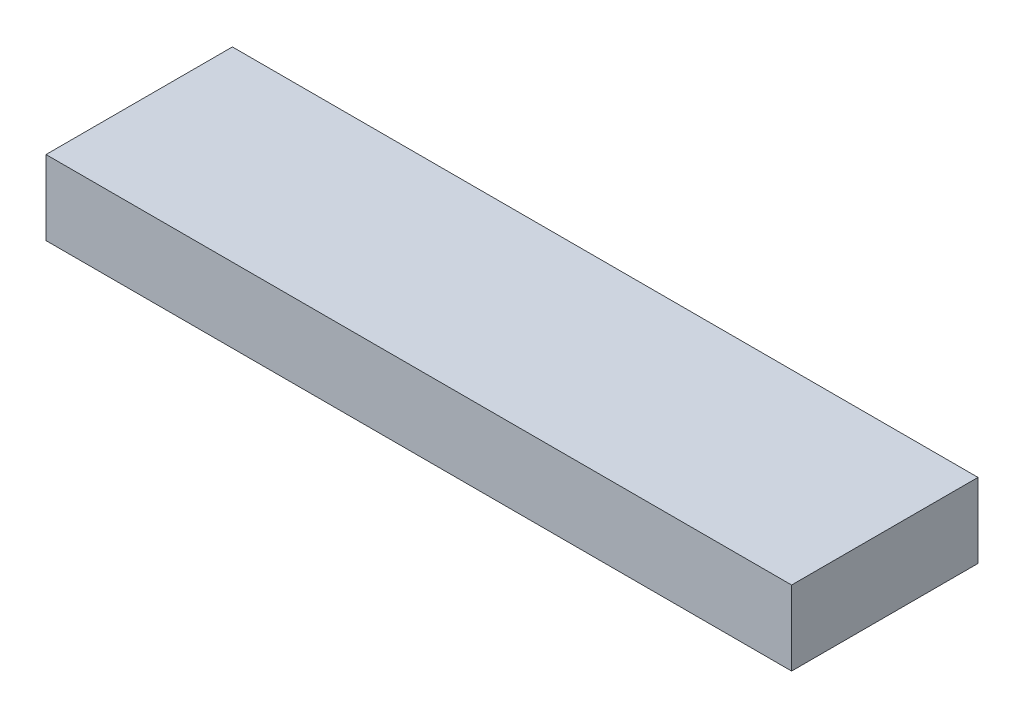
ISO-10303-21;
HEADER;
FILE_DESCRIPTION(('STEP AP214'),'2;1');
FILE_NAME('part.step','',(''),(''),'','','');
FILE_SCHEMA(('AUTOMOTIVE_DESIGN { 1 0 10303 214 1 1 1 1 }'));
ENDSEC;
DATA;
#1=APPLICATION_CONTEXT('core data for automotive mechanical design processes');
#2=APPLICATION_PROTOCOL_DEFINITION('international standard','automotive_design',2000,#1);
#3=PRODUCT_CONTEXT('',#1,'mechanical');
#4=PRODUCT('Part','Part','',(#3));
#5=PRODUCT_RELATED_PRODUCT_CATEGORY('part','',(#4));
#6=PRODUCT_DEFINITION_FORMATION('','',#4);
#7=PRODUCT_DEFINITION_CONTEXT('part definition',#1,'design');
#8=PRODUCT_DEFINITION('design','',#6,#7);
#9=PRODUCT_DEFINITION_SHAPE('','',#8);
#10=(LENGTH_UNIT() NAMED_UNIT(*) SI_UNIT(.MILLI.,.METRE.));
#11=(NAMED_UNIT(*) PLANE_ANGLE_UNIT() SI_UNIT($,.RADIAN.));
#12=(NAMED_UNIT(*) SI_UNIT($,.STERADIAN.) SOLID_ANGLE_UNIT());
#13=UNCERTAINTY_MEASURE_WITH_UNIT(LENGTH_MEASURE(1.E-05),#10,'distance_accuracy_value','');
#14=(GEOMETRIC_REPRESENTATION_CONTEXT(3) GLOBAL_UNCERTAINTY_ASSIGNED_CONTEXT((#13)) GLOBAL_UNIT_ASSIGNED_CONTEXT((#10,
#11,#12)) REPRESENTATION_CONTEXT('',''));
#15=CARTESIAN_POINT('',(0.,0.,0.));
#16=DIRECTION('',(0.,0.,1.));
#17=DIRECTION('',(1.,0.,0.));
#18=AXIS2_PLACEMENT_3D('',#15,#16,#17);
#19=CARTESIAN_POINT('',(0.,0.,0.));
#20=DIRECTION('',(0.,-1.,0.));
#21=DIRECTION('',(0.,0.,-1.));
#22=AXIS2_PLACEMENT_3D('',#19,#20,#21);
#23=PLANE('',#22);
#24=DIRECTION('',(0.,0.,1.));
#25=VECTOR('',#24,1.);
#26=CARTESIAN_POINT('',(0.,0.,0.));
#27=LINE('',#26,#25);
#28=CARTESIAN_POINT('',(0.,0.,-8.));
#29=VERTEX_POINT('',#28);
#30=CARTESIAN_POINT('',(0.,0.,0.));
#31=VERTEX_POINT('',#30);
#32=EDGE_CURVE('E134',#29,#31,#27,.T.);
#33=ORIENTED_EDGE('',*,*,#32,.F.);
#34=DIRECTION('',(-1.,0.,0.));
#35=VECTOR('',#34,1.);
#36=CARTESIAN_POINT('',(0.,0.,-8.));
#37=LINE('',#36,#35);
#38=CARTESIAN_POINT('',(32.,0.,-8.));
#39=VERTEX_POINT('',#38);
#40=EDGE_CURVE('E82',#39,#29,#37,.T.);
#41=ORIENTED_EDGE('',*,*,#40,.F.);
#42=DIRECTION('',(0.,0.,-1.));
#43=VECTOR('',#42,1.);
#44=CARTESIAN_POINT('',(32.,0.,0.));
#45=LINE('',#44,#43);
#46=CARTESIAN_POINT('',(32.,0.,0.));
#47=VERTEX_POINT('',#46);
#48=EDGE_CURVE('E162',#47,#39,#45,.T.);
#49=ORIENTED_EDGE('',*,*,#48,.F.);
#50=DIRECTION('',(1.,0.,0.));
#51=VECTOR('',#50,1.);
#52=CARTESIAN_POINT('',(0.,0.,0.));
#53=LINE('',#52,#51);
#54=EDGE_CURVE('E138',#31,#47,#53,.T.);
#55=ORIENTED_EDGE('',*,*,#54,.F.);
#56=EDGE_LOOP('',(#33,#41,#49,#55));
#57=FACE_BOUND('',#56,.T.);
#58=DIRECTION('',(-1.,0.,0.));
#59=VECTOR('',#58,1.);
#60=CARTESIAN_POINT('',(0.,0.,-6.4));
#61=LINE('',#60,#59);
#62=CARTESIAN_POINT('',(30.4,0.,-6.4));
#63=VERTEX_POINT('',#62);
#64=CARTESIAN_POINT('',(1.6,0.,-6.4));
#65=VERTEX_POINT('',#64);
#66=EDGE_CURVE('E129',#63,#65,#61,.T.);
#67=ORIENTED_EDGE('',*,*,#66,.T.);
#68=DIRECTION('',(0.,0.,1.));
#69=VECTOR('',#68,1.);
#70=CARTESIAN_POINT('',(1.6,0.,0.));
#71=LINE('',#70,#69);
#72=CARTESIAN_POINT('',(1.6,0.,-1.6));
#73=VERTEX_POINT('',#72);
#74=EDGE_CURVE('E148',#65,#73,#71,.T.);
#75=ORIENTED_EDGE('',*,*,#74,.T.);
#76=DIRECTION('',(1.,0.,0.));
#77=VECTOR('',#76,1.);
#78=CARTESIAN_POINT('',(0.,0.,-1.6));
#79=LINE('',#78,#77);
#80=CARTESIAN_POINT('',(30.4,0.,-1.6));
#81=VERTEX_POINT('',#80);
#82=EDGE_CURVE('E133',#73,#81,#79,.T.);
#83=ORIENTED_EDGE('',*,*,#82,.T.);
#84=DIRECTION('',(0.,0.,-1.));
#85=VECTOR('',#84,1.);
#86=CARTESIAN_POINT('',(30.4,0.,0.));
#87=LINE('',#86,#85);
#88=EDGE_CURVE('E52',#81,#63,#87,.T.);
#89=ORIENTED_EDGE('',*,*,#88,.T.);
#90=EDGE_LOOP('',(#67,#75,#83,#89));
#91=FACE_BOUND('',#90,.T.);
#92=ADVANCED_FACE('F37',(#57,#91),#23,.T.);
#93=CARTESIAN_POINT('',(0.,3.2,0.));
#94=DIRECTION('',(1.,0.,0.));
#95=DIRECTION('',(0.,0.,-1.));
#96=AXIS2_PLACEMENT_3D('',#93,#94,#95);
#97=PLANE('',#96);
#98=ORIENTED_EDGE('',*,*,#32,.T.);
#99=DIRECTION('',(0.,-1.,0.));
#100=VECTOR('',#99,1.);
#101=CARTESIAN_POINT('',(0.,3.2,0.));
#102=LINE('',#101,#100);
#103=CARTESIAN_POINT('',(0.,3.2,0.));
#104=VERTEX_POINT('',#103);
#105=EDGE_CURVE('E11',#104,#31,#102,.T.);
#106=ORIENTED_EDGE('',*,*,#105,.F.);
#107=DIRECTION('',(0.,0.,1.));
#108=VECTOR('',#107,1.);
#109=CARTESIAN_POINT('',(0.,3.2,0.));
#110=LINE('',#109,#108);
#111=CARTESIAN_POINT('',(0.,3.2,-8.));
#112=VERTEX_POINT('',#111);
#113=EDGE_CURVE('E154',#112,#104,#110,.T.);
#114=ORIENTED_EDGE('',*,*,#113,.F.);
#115=DIRECTION('',(0.,-1.,0.));
#116=VECTOR('',#115,1.);
#117=CARTESIAN_POINT('',(0.,3.2,-8.));
#118=LINE('',#117,#116);
#119=EDGE_CURVE('E159',#112,#29,#118,.T.);
#120=ORIENTED_EDGE('',*,*,#119,.T.);
#121=EDGE_LOOP('',(#98,#106,#114,#120));
#122=FACE_BOUND('',#121,.T.);
#123=ADVANCED_FACE('F39',(#122),#97,.F.);
#124=CARTESIAN_POINT('',(0.,3.2,0.));
#125=DIRECTION('',(0.,0.,-1.));
#126=DIRECTION('',(-1.,0.,0.));
#127=AXIS2_PLACEMENT_3D('',#124,#125,#126);
#128=PLANE('',#127);
#129=ORIENTED_EDGE('',*,*,#54,.T.);
#130=DIRECTION('',(0.,-1.,0.));
#131=VECTOR('',#130,1.);
#132=CARTESIAN_POINT('',(32.,3.2,0.));
#133=LINE('',#132,#131);
#134=CARTESIAN_POINT('',(32.,3.2,0.));
#135=VERTEX_POINT('',#134);
#136=EDGE_CURVE('E45',#135,#47,#133,.T.);
#137=ORIENTED_EDGE('',*,*,#136,.F.);
#138=DIRECTION('',(1.,0.,0.));
#139=VECTOR('',#138,1.);
#140=CARTESIAN_POINT('',(0.,3.2,0.));
#141=LINE('',#140,#139);
#142=EDGE_CURVE('E89',#104,#135,#141,.T.);
#143=ORIENTED_EDGE('',*,*,#142,.F.);
#144=ORIENTED_EDGE('',*,*,#105,.T.);
#145=EDGE_LOOP('',(#129,#137,#143,#144));
#146=FACE_BOUND('',#145,.T.);
#147=ADVANCED_FACE('F188',(#146),#128,.F.);
#148=CARTESIAN_POINT('',(32.,3.2,0.));
#149=DIRECTION('',(-1.,0.,0.));
#150=DIRECTION('',(0.,0.,1.));
#151=AXIS2_PLACEMENT_3D('',#148,#149,#150);
#152=PLANE('',#151);
#153=ORIENTED_EDGE('',*,*,#48,.T.);
#154=DIRECTION('',(0.,-1.,0.));
#155=VECTOR('',#154,1.);
#156=CARTESIAN_POINT('',(32.,3.2,-8.));
#157=LINE('',#156,#155);
#158=CARTESIAN_POINT('',(32.,3.2,-8.));
#159=VERTEX_POINT('',#158);
#160=EDGE_CURVE('E166',#159,#39,#157,.T.);
#161=ORIENTED_EDGE('',*,*,#160,.F.);
#162=DIRECTION('',(0.,0.,-1.));
#163=VECTOR('',#162,1.);
#164=CARTESIAN_POINT('',(32.,3.2,0.));
#165=LINE('',#164,#163);
#166=EDGE_CURVE('E157',#135,#159,#165,.T.);
#167=ORIENTED_EDGE('',*,*,#166,.F.);
#168=ORIENTED_EDGE('',*,*,#136,.T.);
#169=EDGE_LOOP('',(#153,#161,#167,#168));
#170=FACE_BOUND('',#169,.T.);
#171=ADVANCED_FACE('F171',(#170),#152,.F.);
#172=CARTESIAN_POINT('',(0.,3.2,-8.));
#173=DIRECTION('',(0.,0.,1.));
#174=DIRECTION('',(1.,0.,0.));
#175=AXIS2_PLACEMENT_3D('',#172,#173,#174);
#176=PLANE('',#175);
#177=ORIENTED_EDGE('',*,*,#40,.T.);
#178=ORIENTED_EDGE('',*,*,#119,.F.);
#179=DIRECTION('',(-1.,0.,0.));
#180=VECTOR('',#179,1.);
#181=CARTESIAN_POINT('',(0.,3.2,-8.));
#182=LINE('',#181,#180);
#183=EDGE_CURVE('E61',#159,#112,#182,.T.);
#184=ORIENTED_EDGE('',*,*,#183,.F.);
#185=ORIENTED_EDGE('',*,*,#160,.T.);
#186=EDGE_LOOP('',(#177,#178,#184,#185));
#187=FACE_BOUND('',#186,.T.);
#188=ADVANCED_FACE('F179',(#187),#176,.F.);
#189=CARTESIAN_POINT('',(0.,3.2,0.));
#190=DIRECTION('',(0.,-1.,0.));
#191=DIRECTION('',(0.,0.,-1.));
#192=AXIS2_PLACEMENT_3D('',#189,#190,#191);
#193=PLANE('',#192);
#194=ORIENTED_EDGE('',*,*,#113,.T.);
#195=ORIENTED_EDGE('',*,*,#142,.T.);
#196=ORIENTED_EDGE('',*,*,#166,.T.);
#197=ORIENTED_EDGE('',*,*,#183,.T.);
#198=EDGE_LOOP('',(#194,#195,#196,#197));
#199=FACE_BOUND('',#198,.T.);
#200=ADVANCED_FACE('F181',(#199),#193,.F.);
#201=CARTESIAN_POINT('',(1.6,3.2,0.));
#202=DIRECTION('',(1.,0.,0.));
#203=DIRECTION('',(0.,0.,-1.));
#204=AXIS2_PLACEMENT_3D('',#201,#202,#203);
#205=PLANE('',#204);
#206=ORIENTED_EDGE('',*,*,#74,.F.);
#207=DIRECTION('',(0.,-1.,0.));
#208=VECTOR('',#207,1.);
#209=CARTESIAN_POINT('',(1.6,3.2,-6.4));
#210=LINE('',#209,#208);
#211=CARTESIAN_POINT('',(1.6,1.6,-6.4));
#212=VERTEX_POINT('',#211);
#213=EDGE_CURVE('E128',#212,#65,#210,.T.);
#214=ORIENTED_EDGE('',*,*,#213,.F.);
#215=DIRECTION('',(0.,0.,1.));
#216=VECTOR('',#215,1.);
#217=CARTESIAN_POINT('',(1.6,1.6,0.));
#218=LINE('',#217,#216);
#219=CARTESIAN_POINT('',(1.6,1.6,-1.6));
#220=VERTEX_POINT('',#219);
#221=EDGE_CURVE('E116',#212,#220,#218,.T.);
#222=ORIENTED_EDGE('',*,*,#221,.T.);
#223=DIRECTION('',(0.,-1.,0.));
#224=VECTOR('',#223,1.);
#225=CARTESIAN_POINT('',(1.6,3.2,-1.6));
#226=LINE('',#225,#224);
#227=EDGE_CURVE('E126',#220,#73,#226,.T.);
#228=ORIENTED_EDGE('',*,*,#227,.T.);
#229=EDGE_LOOP('',(#206,#214,#222,#228));
#230=FACE_BOUND('',#229,.T.);
#231=ADVANCED_FACE('F125',(#230),#205,.T.);
#232=CARTESIAN_POINT('',(0.,3.2,-1.6));
#233=DIRECTION('',(0.,0.,-1.));
#234=DIRECTION('',(-1.,0.,0.));
#235=AXIS2_PLACEMENT_3D('',#232,#233,#234);
#236=PLANE('',#235);
#237=ORIENTED_EDGE('',*,*,#82,.F.);
#238=ORIENTED_EDGE('',*,*,#227,.F.);
#239=DIRECTION('',(1.,0.,0.));
#240=VECTOR('',#239,1.);
#241=CARTESIAN_POINT('',(0.,1.6,-1.6));
#242=LINE('',#241,#240);
#243=CARTESIAN_POINT('',(30.4,1.6,-1.6));
#244=VERTEX_POINT('',#243);
#245=EDGE_CURVE('E112',#220,#244,#242,.T.);
#246=ORIENTED_EDGE('',*,*,#245,.T.);
#247=DIRECTION('',(0.,-1.,0.));
#248=VECTOR('',#247,1.);
#249=CARTESIAN_POINT('',(30.4,3.2,-1.6));
#250=LINE('',#249,#248);
#251=EDGE_CURVE('E135',#244,#81,#250,.T.);
#252=ORIENTED_EDGE('',*,*,#251,.T.);
#253=EDGE_LOOP('',(#237,#238,#246,#252));
#254=FACE_BOUND('',#253,.T.);
#255=ADVANCED_FACE('F131',(#254),#236,.T.);
#256=CARTESIAN_POINT('',(30.4,3.2,0.));
#257=DIRECTION('',(-1.,0.,0.));
#258=DIRECTION('',(0.,0.,1.));
#259=AXIS2_PLACEMENT_3D('',#256,#257,#258);
#260=PLANE('',#259);
#261=ORIENTED_EDGE('',*,*,#88,.F.);
#262=ORIENTED_EDGE('',*,*,#251,.F.);
#263=DIRECTION('',(0.,0.,-1.));
#264=VECTOR('',#263,1.);
#265=CARTESIAN_POINT('',(30.4,1.6,0.));
#266=LINE('',#265,#264);
#267=CARTESIAN_POINT('',(30.4,1.6,-6.4));
#268=VERTEX_POINT('',#267);
#269=EDGE_CURVE('E117',#244,#268,#266,.T.);
#270=ORIENTED_EDGE('',*,*,#269,.T.);
#271=DIRECTION('',(0.,-1.,0.));
#272=VECTOR('',#271,1.);
#273=CARTESIAN_POINT('',(30.4,3.2,-6.4));
#274=LINE('',#273,#272);
#275=EDGE_CURVE('E140',#268,#63,#274,.T.);
#276=ORIENTED_EDGE('',*,*,#275,.T.);
#277=EDGE_LOOP('',(#261,#262,#270,#276));
#278=FACE_BOUND('',#277,.T.);
#279=ADVANCED_FACE('F201',(#278),#260,.T.);
#280=CARTESIAN_POINT('',(0.,3.2,-6.4));
#281=DIRECTION('',(0.,0.,1.));
#282=DIRECTION('',(1.,0.,0.));
#283=AXIS2_PLACEMENT_3D('',#280,#281,#282);
#284=PLANE('',#283);
#285=ORIENTED_EDGE('',*,*,#66,.F.);
#286=ORIENTED_EDGE('',*,*,#275,.F.);
#287=DIRECTION('',(-1.,0.,0.));
#288=VECTOR('',#287,1.);
#289=CARTESIAN_POINT('',(0.,1.6,-6.4));
#290=LINE('',#289,#288);
#291=EDGE_CURVE('E143',#268,#212,#290,.T.);
#292=ORIENTED_EDGE('',*,*,#291,.T.);
#293=ORIENTED_EDGE('',*,*,#213,.T.);
#294=EDGE_LOOP('',(#285,#286,#292,#293));
#295=FACE_BOUND('',#294,.T.);
#296=ADVANCED_FACE('F198',(#295),#284,.T.);
#297=CARTESIAN_POINT('',(0.,1.6,0.));
#298=DIRECTION('',(0.,-1.,0.));
#299=DIRECTION('',(0.,0.,-1.));
#300=AXIS2_PLACEMENT_3D('',#297,#298,#299);
#301=PLANE('',#300);
#302=ORIENTED_EDGE('',*,*,#221,.F.);
#303=ORIENTED_EDGE('',*,*,#291,.F.);
#304=ORIENTED_EDGE('',*,*,#269,.F.);
#305=ORIENTED_EDGE('',*,*,#245,.F.);
#306=EDGE_LOOP('',(#302,#303,#304,#305));
#307=FACE_BOUND('',#306,.T.);
#308=ADVANCED_FACE('F114',(#307),#301,.T.);
#309=CLOSED_SHELL('',(#92,#123,#147,#171,#188,#200,#231,#255,#279,#296,#308));
#310=MANIFOLD_SOLID_BREP('B2',#309);
#311=ADVANCED_BREP_SHAPE_REPRESENTATION('',(#18,#310),#14);
#312=SHAPE_DEFINITION_REPRESENTATION(#9,#311);
ENDSEC;
END-ISO-10303-21;
